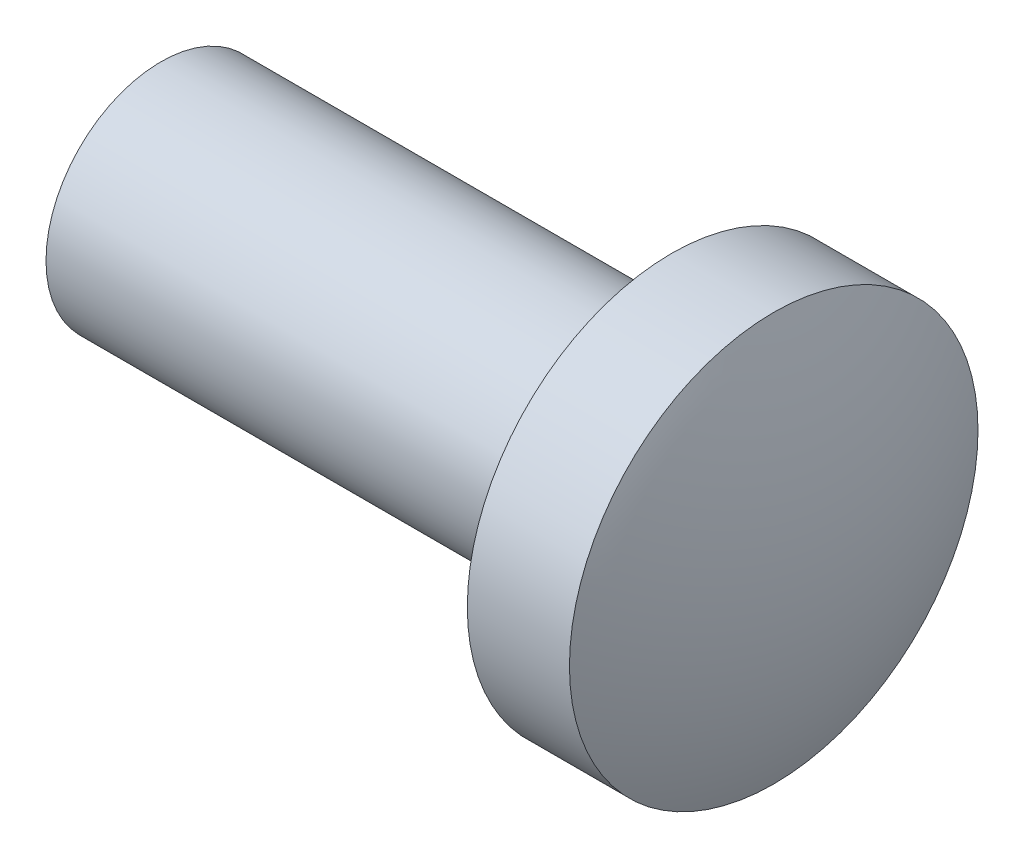
ISO-10303-21;
HEADER;
FILE_DESCRIPTION(('STEP AP214'),'2;1');
FILE_NAME('part.step','',(''),(''),'','','');
FILE_SCHEMA(('AUTOMOTIVE_DESIGN { 1 0 10303 214 1 1 1 1 }'));
ENDSEC;
DATA;
#1=APPLICATION_CONTEXT('core data for automotive mechanical design processes');
#2=APPLICATION_PROTOCOL_DEFINITION('international standard','automotive_design',2000,#1);
#3=PRODUCT_CONTEXT('',#1,'mechanical');
#4=PRODUCT('Part','Part','',(#3));
#5=PRODUCT_RELATED_PRODUCT_CATEGORY('part','',(#4));
#6=PRODUCT_DEFINITION_FORMATION('','',#4);
#7=PRODUCT_DEFINITION_CONTEXT('part definition',#1,'design');
#8=PRODUCT_DEFINITION('design','',#6,#7);
#9=PRODUCT_DEFINITION_SHAPE('','',#8);
#10=(LENGTH_UNIT() NAMED_UNIT(*) SI_UNIT(.MILLI.,.METRE.));
#11=(NAMED_UNIT(*) PLANE_ANGLE_UNIT() SI_UNIT($,.RADIAN.));
#12=(NAMED_UNIT(*) SI_UNIT($,.STERADIAN.) SOLID_ANGLE_UNIT());
#13=UNCERTAINTY_MEASURE_WITH_UNIT(LENGTH_MEASURE(1.E-05),#10,'distance_accuracy_value','');
#14=(GEOMETRIC_REPRESENTATION_CONTEXT(3) GLOBAL_UNCERTAINTY_ASSIGNED_CONTEXT((#13)) GLOBAL_UNIT_ASSIGNED_CONTEXT((#10,
#11,#12)) REPRESENTATION_CONTEXT('',''));
#15=CARTESIAN_POINT('',(0.,0.,0.));
#16=DIRECTION('',(0.,0.,1.));
#17=DIRECTION('',(1.,0.,0.));
#18=AXIS2_PLACEMENT_3D('',#15,#16,#17);
#19=CARTESIAN_POINT('',(3.01323529411768,0.,0.));
#20=DIRECTION('',(-1.,0.,0.));
#21=DIRECTION('',(0.,-1.,0.));
#22=AXIS2_PLACEMENT_3D('',#19,#20,#21);
#23=SPHERICAL_SURFACE('',#22,9.83676470588232);
#24=CARTESIAN_POINT('',(12.,0.,0.));
#25=DIRECTION('',(-1.,0.,0.));
#26=DIRECTION('',(0.,0.,1.));
#27=AXIS2_PLACEMENT_3D('',#24,#25,#26);
#28=CIRCLE('',#27,4.);
#29=CARTESIAN_POINT('',(12.,0.,4.));
#30=VERTEX_POINT('',#29);
#31=EDGE_CURVE('E10',#30,#30,#28,.T.);
#32=ORIENTED_EDGE('',*,*,#31,.F.);
#33=EDGE_LOOP('',(#32));
#34=FACE_BOUND('',#33,.T.);
#35=ADVANCED_FACE('F49',(#34),#23,.T.);
#36=CARTESIAN_POINT('',(0.,0.,0.));
#37=DIRECTION('',(-1.,0.,0.));
#38=DIRECTION('',(0.,0.,1.));
#39=AXIS2_PLACEMENT_3D('',#36,#37,#38);
#40=CYLINDRICAL_SURFACE('',#39,4.);
#41=CARTESIAN_POINT('',(10.,0.,0.));
#42=DIRECTION('',(-1.,0.,0.));
#43=DIRECTION('',(0.,0.,1.));
#44=AXIS2_PLACEMENT_3D('',#41,#42,#43);
#45=CIRCLE('',#44,4.);
#46=CARTESIAN_POINT('',(10.,0.,4.));
#47=VERTEX_POINT('',#46);
#48=EDGE_CURVE('E55',#47,#47,#45,.T.);
#49=ORIENTED_EDGE('',*,*,#48,.F.);
#50=EDGE_LOOP('',(#49));
#51=FACE_BOUND('',#50,.T.);
#52=ORIENTED_EDGE('',*,*,#31,.T.);
#53=EDGE_LOOP('',(#52));
#54=FACE_BOUND('',#53,.T.);
#55=ADVANCED_FACE('F99',(#51,#54),#40,.T.);
#56=CARTESIAN_POINT('',(10.,2.25,0.));
#57=DIRECTION('',(1.,0.,0.));
#58=DIRECTION('',(0.,0.,-1.));
#59=AXIS2_PLACEMENT_3D('',#56,#57,#58);
#60=PLANE('',#59);
#61=CARTESIAN_POINT('',(10.,0.,0.));
#62=DIRECTION('',(-1.,0.,0.));
#63=DIRECTION('',(0.,0.,1.));
#64=AXIS2_PLACEMENT_3D('',#61,#62,#63);
#65=CIRCLE('',#64,2.25);
#66=CARTESIAN_POINT('',(10.,0.,2.25));
#67=VERTEX_POINT('',#66);
#68=EDGE_CURVE('E59',#67,#67,#65,.T.);
#69=ORIENTED_EDGE('',*,*,#68,.F.);
#70=EDGE_LOOP('',(#69));
#71=FACE_BOUND('',#70,.T.);
#72=ORIENTED_EDGE('',*,*,#48,.T.);
#73=EDGE_LOOP('',(#72));
#74=FACE_BOUND('',#73,.T.);
#75=ADVANCED_FACE('F104',(#71,#74),#60,.F.);
#76=CARTESIAN_POINT('',(0.,0.,0.));
#77=DIRECTION('',(-1.,0.,0.));
#78=DIRECTION('',(0.,0.,1.));
#79=AXIS2_PLACEMENT_3D('',#76,#77,#78);
#80=CYLINDRICAL_SURFACE('',#79,2.25);
#81=CARTESIAN_POINT('',(0.,0.,0.));
#82=DIRECTION('',(-1.,0.,0.));
#83=DIRECTION('',(0.,0.,1.));
#84=AXIS2_PLACEMENT_3D('',#81,#82,#83);
#85=CIRCLE('',#84,2.25);
#86=CARTESIAN_POINT('',(0.,0.,2.25));
#87=VERTEX_POINT('',#86);
#88=EDGE_CURVE('E63',#87,#87,#85,.T.);
#89=ORIENTED_EDGE('',*,*,#88,.F.);
#90=EDGE_LOOP('',(#89));
#91=FACE_BOUND('',#90,.T.);
#92=ORIENTED_EDGE('',*,*,#68,.T.);
#93=EDGE_LOOP('',(#92));
#94=FACE_BOUND('',#93,.T.);
#95=ADVANCED_FACE('F109',(#91,#94),#80,.T.);
#96=CARTESIAN_POINT('',(0.,0.,0.));
#97=DIRECTION('',(1.,0.,0.));
#98=DIRECTION('',(0.,0.,-1.));
#99=AXIS2_PLACEMENT_3D('',#96,#97,#98);
#100=PLANE('',#99);
#101=CARTESIAN_POINT('',(0.,0.,0.));
#102=DIRECTION('',(-1.,0.,0.));
#103=DIRECTION('',(0.,0.,1.));
#104=AXIS2_PLACEMENT_3D('',#101,#102,#103);
#105=CIRCLE('',#104,1.25);
#106=CARTESIAN_POINT('',(0.,0.,1.25));
#107=VERTEX_POINT('',#106);
#108=EDGE_CURVE('E68',#107,#107,#105,.T.);
#109=ORIENTED_EDGE('',*,*,#108,.F.);
#110=EDGE_LOOP('',(#109));
#111=FACE_BOUND('',#110,.T.);
#112=ORIENTED_EDGE('',*,*,#88,.T.);
#113=EDGE_LOOP('',(#112));
#114=FACE_BOUND('',#113,.T.);
#115=ADVANCED_FACE('F115',(#111,#114),#100,.F.);
#116=CARTESIAN_POINT('',(11.25,0.,0.));
#117=DIRECTION('',(-1.,0.,0.));
#118=DIRECTION('',(0.,0.,1.));
#119=AXIS2_PLACEMENT_3D('',#116,#117,#118);
#120=CYLINDRICAL_SURFACE('',#119,1.25);
#121=CARTESIAN_POINT('',(11.25,0.,0.));
#122=DIRECTION('',(-1.,0.,0.));
#123=DIRECTION('',(0.,0.,1.));
#124=AXIS2_PLACEMENT_3D('',#121,#122,#123);
#125=CIRCLE('',#124,1.25);
#126=CARTESIAN_POINT('',(11.25,0.,1.25));
#127=VERTEX_POINT('',#126);
#128=EDGE_CURVE('E71',#127,#127,#125,.T.);
#129=CARTESIAN_POINT('',(11.25,0.,1.25));
#130=CARTESIAN_POINT('',(11.1328125,0.,1.25));
#131=CARTESIAN_POINT('',(11.015625,0.,1.25));
#132=CARTESIAN_POINT('',(10.78125,0.,1.25));
#133=CARTESIAN_POINT('',(10.6640625,0.,1.25));
#134=CARTESIAN_POINT('',(10.4296875,0.,1.25));
#135=CARTESIAN_POINT('',(10.3125,0.,1.25));
#136=CARTESIAN_POINT('',(10.078125,0.,1.25));
#137=CARTESIAN_POINT('',(9.9609375,0.,1.25));
#138=CARTESIAN_POINT('',(9.7265625,0.,1.25));
#139=CARTESIAN_POINT('',(9.609375,0.,1.25));
#140=CARTESIAN_POINT('',(9.375,0.,1.25));
#141=CARTESIAN_POINT('',(9.2578125,0.,1.25));
#142=CARTESIAN_POINT('',(9.0234375,0.,1.25));
#143=CARTESIAN_POINT('',(8.90625,0.,1.25));
#144=CARTESIAN_POINT('',(8.671875,0.,1.25));
#145=CARTESIAN_POINT('',(8.5546875,0.,1.25));
#146=CARTESIAN_POINT('',(8.3203125,0.,1.25));
#147=CARTESIAN_POINT('',(8.203125,0.,1.25));
#148=CARTESIAN_POINT('',(7.96875,0.,1.25));
#149=CARTESIAN_POINT('',(7.8515625,0.,1.25));
#150=CARTESIAN_POINT('',(7.6171875,0.,1.25));
#151=CARTESIAN_POINT('',(7.5,0.,1.25));
#152=CARTESIAN_POINT('',(7.265625,0.,1.25));
#153=CARTESIAN_POINT('',(7.1484375,0.,1.25));
#154=CARTESIAN_POINT('',(6.9140625,0.,1.25));
#155=CARTESIAN_POINT('',(6.796875,0.,1.25));
#156=CARTESIAN_POINT('',(6.5625,0.,1.25));
#157=CARTESIAN_POINT('',(6.4453125,0.,1.25));
#158=CARTESIAN_POINT('',(6.2109375,0.,1.25));
#159=CARTESIAN_POINT('',(6.09375,0.,1.25));
#160=CARTESIAN_POINT('',(5.859375,0.,1.25));
#161=CARTESIAN_POINT('',(5.7421875,0.,1.25));
#162=CARTESIAN_POINT('',(5.5078125,0.,1.25));
#163=CARTESIAN_POINT('',(5.390625,0.,1.25));
#164=CARTESIAN_POINT('',(5.15625,0.,1.25));
#165=CARTESIAN_POINT('',(5.0390625,0.,1.25));
#166=CARTESIAN_POINT('',(4.8046875,0.,1.25));
#167=CARTESIAN_POINT('',(4.6875,0.,1.25));
#168=CARTESIAN_POINT('',(4.453125,0.,1.25));
#169=CARTESIAN_POINT('',(4.3359375,0.,1.25));
#170=CARTESIAN_POINT('',(4.1015625,0.,1.25));
#171=CARTESIAN_POINT('',(3.984375,0.,1.25));
#172=CARTESIAN_POINT('',(3.75,0.,1.25));
#173=CARTESIAN_POINT('',(3.6328125,0.,1.25));
#174=CARTESIAN_POINT('',(3.3984375,0.,1.25));
#175=CARTESIAN_POINT('',(3.28125,0.,1.25));
#176=CARTESIAN_POINT('',(3.046875,0.,1.25));
#177=CARTESIAN_POINT('',(2.9296875,0.,1.25));
#178=CARTESIAN_POINT('',(2.6953125,0.,1.25));
#179=CARTESIAN_POINT('',(2.578125,0.,1.25));
#180=CARTESIAN_POINT('',(2.34375,0.,1.25));
#181=CARTESIAN_POINT('',(2.2265625,0.,1.25));
#182=CARTESIAN_POINT('',(1.9921875,0.,1.25));
#183=CARTESIAN_POINT('',(1.875,0.,1.25));
#184=CARTESIAN_POINT('',(1.640625,0.,1.25));
#185=CARTESIAN_POINT('',(1.5234375,0.,1.25));
#186=CARTESIAN_POINT('',(1.2890625,0.,1.25));
#187=CARTESIAN_POINT('',(1.171875,0.,1.25));
#188=CARTESIAN_POINT('',(0.937500000000002,0.,1.25));
#189=CARTESIAN_POINT('',(0.820312500000002,0.,1.25));
#190=CARTESIAN_POINT('',(0.585937500000002,0.,1.25));
#191=CARTESIAN_POINT('',(0.468750000000002,0.,1.25));
#192=CARTESIAN_POINT('',(0.234375000000001,0.,1.25));
#193=CARTESIAN_POINT('',(0.117187500000002,0.,1.25));
#194=CARTESIAN_POINT('',(0.,0.,1.25));
#195=B_SPLINE_CURVE_WITH_KNOTS('',3,(#129,#130,#131,#132,#133,#134,#135,#136,#137,#138,#139,
#140,#141,#142,#143,#144,#145,#146,#147,#148,#149,#150,#151,#152,#153,#154,#155,#156,#157,#158,
#159,#160,#161,#162,#163,#164,#165,#166,#167,#168,#169,#170,#171,#172,#173,#174,#175,#176,#177,
#178,#179,#180,#181,#182,#183,#184,#185,#186,#187,#188,#189,#190,#191,#192,#193,#194),
.UNSPECIFIED.,.F.,.F.,(4,2,2,2,2,2,2,2,2,2,2,2,2,2,2,2,2,2,2,2,2,2,2,2,2,2,2,2,2,2,2,2,4),(0.,
0.351562500000001,0.703125000000001,1.0546875,1.40625,1.7578125,2.109375,2.4609375,2.8125,
3.1640625,3.515625,3.8671875,4.21875,4.5703125,4.921875,5.2734375,5.625,5.9765625,6.328125,
6.6796875,7.03125,7.3828125,7.734375,8.0859375,8.4375,8.7890625,9.140625,9.4921875,9.84375,
10.1953125,10.546875,10.8984375,11.25),.UNSPECIFIED.);
#196=EDGE_CURVE('BSEAM86',#127,#107,#195,.T.);
#197=ORIENTED_EDGE('',*,*,#128,.F.);
#198=ORIENTED_EDGE('',*,*,#108,.T.);
#199=ORIENTED_EDGE('',*,*,#196,.T.);
#200=ORIENTED_EDGE('',*,*,#196,.F.);
#201=EDGE_LOOP('',(#197,#199,#198,#200));
#202=FACE_BOUND('',#201,.T.);
#203=ADVANCED_FACE('F86',(#202),#120,.F.);
#204=CARTESIAN_POINT('',(11.6,0.,0.));
#205=DIRECTION('',(-1.,0.,0.));
#206=DIRECTION('',(0.,0.,1.));
#207=AXIS2_PLACEMENT_3D('',#204,#205,#206);
#208=CYLINDRICAL_SURFACE('',#207,1.7);
#209=CARTESIAN_POINT('',(11.6,0.,0.));
#210=DIRECTION('',(-1.,0.,0.));
#211=DIRECTION('',(0.,0.,1.));
#212=AXIS2_PLACEMENT_3D('',#209,#210,#211);
#213=CIRCLE('',#212,1.7);
#214=CARTESIAN_POINT('',(11.6,0.,1.7));
#215=VERTEX_POINT('',#214);
#216=EDGE_CURVE('E74',#215,#215,#213,.T.);
#217=ORIENTED_EDGE('',*,*,#216,.F.);
#218=EDGE_LOOP('',(#217));
#219=FACE_BOUND('',#218,.T.);
#220=CARTESIAN_POINT('',(11.25,0.,0.));
#221=DIRECTION('',(-1.,0.,0.));
#222=DIRECTION('',(0.,0.,1.));
#223=AXIS2_PLACEMENT_3D('',#220,#221,#222);
#224=CIRCLE('',#223,1.7);
#225=CARTESIAN_POINT('',(11.25,0.,1.7));
#226=VERTEX_POINT('',#225);
#227=EDGE_CURVE('E75',#226,#226,#224,.T.);
#228=ORIENTED_EDGE('',*,*,#227,.T.);
#229=EDGE_LOOP('',(#228));
#230=FACE_BOUND('',#229,.T.);
#231=ADVANCED_FACE('F83',(#219,#230),#208,.F.);
#232=CARTESIAN_POINT('',(11.6,0.,0.));
#233=DIRECTION('',(-1.,0.,0.));
#234=DIRECTION('',(0.,0.,1.));
#235=AXIS2_PLACEMENT_3D('',#232,#233,#234);
#236=PLANE('',#235);
#237=ORIENTED_EDGE('',*,*,#216,.T.);
#238=EDGE_LOOP('',(#237));
#239=FACE_BOUND('',#238,.T.);
#240=ADVANCED_FACE('F81',(#239),#236,.T.);
#241=CARTESIAN_POINT('',(11.25,0.,0.));
#242=DIRECTION('',(-1.,0.,0.));
#243=DIRECTION('',(0.,0.,1.));
#244=AXIS2_PLACEMENT_3D('',#241,#242,#243);
#245=PLANE('',#244);
#246=ORIENTED_EDGE('',*,*,#128,.T.);
#247=EDGE_LOOP('',(#246));
#248=FACE_BOUND('',#247,.T.);
#249=ORIENTED_EDGE('',*,*,#227,.F.);
#250=EDGE_LOOP('',(#249));
#251=FACE_BOUND('',#250,.T.);
#252=ADVANCED_FACE('F90',(#248,#251),#245,.F.);
#253=CLOSED_SHELL('',(#35,#55,#75,#95,#115,#203,#231,#240,#252));
#254=MANIFOLD_SOLID_BREP('B2',#253);
#255=ADVANCED_BREP_SHAPE_REPRESENTATION('',(#18,#254),#14);
#256=SHAPE_DEFINITION_REPRESENTATION(#9,#255);
ENDSEC;
END-ISO-10303-21;
